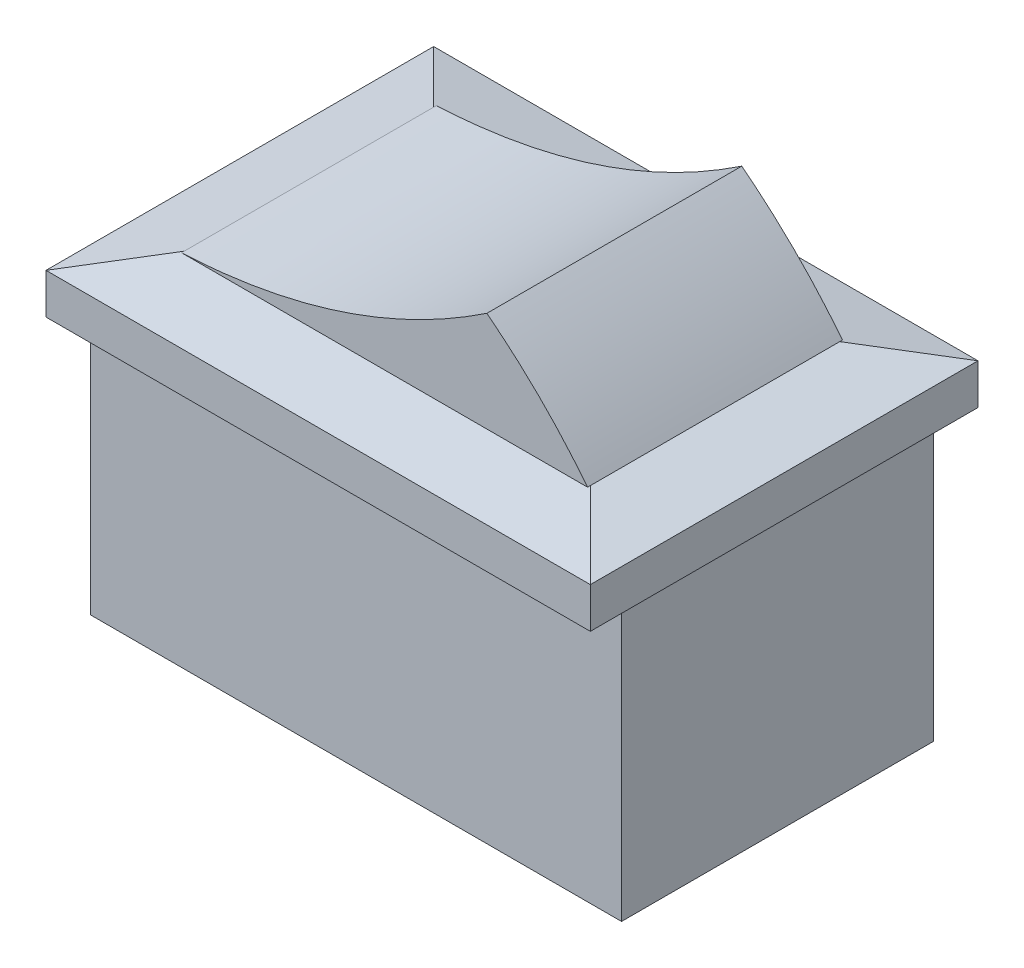
ISO-10303-21;
HEADER;
FILE_DESCRIPTION(('STEP AP214'),'2;1');
FILE_NAME('part.step','',(''),(''),'','','');
FILE_SCHEMA(('AUTOMOTIVE_DESIGN { 1 0 10303 214 1 1 1 1 }'));
ENDSEC;
DATA;
#1=APPLICATION_CONTEXT('core data for automotive mechanical design processes');
#2=APPLICATION_PROTOCOL_DEFINITION('international standard','automotive_design',2000,#1);
#3=PRODUCT_CONTEXT('',#1,'mechanical');
#4=PRODUCT('Part','Part','',(#3));
#5=PRODUCT_RELATED_PRODUCT_CATEGORY('part','',(#4));
#6=PRODUCT_DEFINITION_FORMATION('','',#4);
#7=PRODUCT_DEFINITION_CONTEXT('part definition',#1,'design');
#8=PRODUCT_DEFINITION('design','',#6,#7);
#9=PRODUCT_DEFINITION_SHAPE('','',#8);
#10=(LENGTH_UNIT() NAMED_UNIT(*) SI_UNIT(.MILLI.,.METRE.));
#11=(NAMED_UNIT(*) PLANE_ANGLE_UNIT() SI_UNIT($,.RADIAN.));
#12=(NAMED_UNIT(*) SI_UNIT($,.STERADIAN.) SOLID_ANGLE_UNIT());
#13=UNCERTAINTY_MEASURE_WITH_UNIT(LENGTH_MEASURE(1.E-05),#10,'distance_accuracy_value','');
#14=(GEOMETRIC_REPRESENTATION_CONTEXT(3) GLOBAL_UNCERTAINTY_ASSIGNED_CONTEXT((#13)) GLOBAL_UNIT_ASSIGNED_CONTEXT((#10,
#11,#12)) REPRESENTATION_CONTEXT('',''));
#15=CARTESIAN_POINT('',(0.,0.,0.));
#16=DIRECTION('',(0.,0.,1.));
#17=DIRECTION('',(1.,0.,0.));
#18=AXIS2_PLACEMENT_3D('',#15,#16,#17);
#19=CARTESIAN_POINT('',(10.16,-10.4648,-5.969));
#20=DIRECTION('',(1.,0.,0.));
#21=DIRECTION('',(0.,0.,-1.));
#22=AXIS2_PLACEMENT_3D('',#19,#20,#21);
#23=PLANE('',#22);
#24=DIRECTION('',(0.,0.,-1.));
#25=VECTOR('',#24,1.);
#26=CARTESIAN_POINT('',(10.16,0.,-5.969));
#27=LINE('',#26,#25);
#28=CARTESIAN_POINT('',(10.16,0.,5.969));
#29=VERTEX_POINT('',#28);
#30=CARTESIAN_POINT('',(10.16,0.,-5.969));
#31=VERTEX_POINT('',#30);
#32=EDGE_CURVE('E213',#29,#31,#27,.T.);
#33=ORIENTED_EDGE('',*,*,#32,.F.);
#34=DIRECTION('',(0.,1.,0.));
#35=VECTOR('',#34,1.);
#36=CARTESIAN_POINT('',(10.16,-10.4648,5.969));
#37=LINE('',#36,#35);
#38=CARTESIAN_POINT('',(10.16,-10.4648,5.969));
#39=VERTEX_POINT('',#38);
#40=EDGE_CURVE('E246',#39,#29,#37,.T.);
#41=ORIENTED_EDGE('',*,*,#40,.F.);
#42=DIRECTION('',(0.,0.,-1.));
#43=VECTOR('',#42,1.);
#44=CARTESIAN_POINT('',(10.16,-10.4648,-5.969));
#45=LINE('',#44,#43);
#46=CARTESIAN_POINT('',(10.16,-10.4648,-5.969));
#47=VERTEX_POINT('',#46);
#48=EDGE_CURVE('E214',#39,#47,#45,.T.);
#49=ORIENTED_EDGE('',*,*,#48,.T.);
#50=DIRECTION('',(0.,1.,0.));
#51=VECTOR('',#50,1.);
#52=CARTESIAN_POINT('',(10.16,-10.4648,-5.969));
#53=LINE('',#52,#51);
#54=EDGE_CURVE('E231',#47,#31,#53,.T.);
#55=ORIENTED_EDGE('',*,*,#54,.T.);
#56=EDGE_LOOP('',(#33,#41,#49,#55));
#57=FACE_BOUND('',#56,.T.);
#58=ADVANCED_FACE('F49',(#57),#23,.T.);
#59=CARTESIAN_POINT('',(-10.16,-10.4648,5.969));
#60=DIRECTION('',(0.,0.,1.));
#61=DIRECTION('',(1.,0.,0.));
#62=AXIS2_PLACEMENT_3D('',#59,#60,#61);
#63=PLANE('',#62);
#64=DIRECTION('',(1.,0.,0.));
#65=VECTOR('',#64,1.);
#66=CARTESIAN_POINT('',(-10.16,0.,5.969));
#67=LINE('',#66,#65);
#68=CARTESIAN_POINT('',(-10.16,0.,5.969));
#69=VERTEX_POINT('',#68);
#70=EDGE_CURVE('E219',#69,#29,#67,.T.);
#71=ORIENTED_EDGE('',*,*,#70,.F.);
#72=DIRECTION('',(0.,1.,0.));
#73=VECTOR('',#72,1.);
#74=CARTESIAN_POINT('',(-10.16,-10.4648,5.969));
#75=LINE('',#74,#73);
#76=CARTESIAN_POINT('',(-10.16,-10.4648,5.969));
#77=VERTEX_POINT('',#76);
#78=EDGE_CURVE('E251',#77,#69,#75,.T.);
#79=ORIENTED_EDGE('',*,*,#78,.F.);
#80=DIRECTION('',(1.,0.,0.));
#81=VECTOR('',#80,1.);
#82=CARTESIAN_POINT('',(-10.16,-10.4648,5.969));
#83=LINE('',#82,#81);
#84=EDGE_CURVE('E227',#77,#39,#83,.T.);
#85=ORIENTED_EDGE('',*,*,#84,.T.);
#86=ORIENTED_EDGE('',*,*,#40,.T.);
#87=EDGE_LOOP('',(#71,#79,#85,#86));
#88=FACE_BOUND('',#87,.T.);
#89=ADVANCED_FACE('F340',(#88),#63,.T.);
#90=CARTESIAN_POINT('',(-10.16,-10.4648,-5.969));
#91=DIRECTION('',(-1.,0.,0.));
#92=DIRECTION('',(0.,0.,1.));
#93=AXIS2_PLACEMENT_3D('',#90,#91,#92);
#94=PLANE('',#93);
#95=DIRECTION('',(0.,0.,1.));
#96=VECTOR('',#95,1.);
#97=CARTESIAN_POINT('',(-10.16,0.,-5.969));
#98=LINE('',#97,#96);
#99=CARTESIAN_POINT('',(-10.16,0.,-5.969));
#100=VERTEX_POINT('',#99);
#101=EDGE_CURVE('E239',#100,#69,#98,.T.);
#102=ORIENTED_EDGE('',*,*,#101,.F.);
#103=DIRECTION('',(0.,1.,0.));
#104=VECTOR('',#103,1.);
#105=CARTESIAN_POINT('',(-10.16,-10.4648,-5.969));
#106=LINE('',#105,#104);
#107=CARTESIAN_POINT('',(-10.16,-10.4648,-5.969));
#108=VERTEX_POINT('',#107);
#109=EDGE_CURVE('E254',#108,#100,#106,.T.);
#110=ORIENTED_EDGE('',*,*,#109,.F.);
#111=DIRECTION('',(0.,0.,1.));
#112=VECTOR('',#111,1.);
#113=CARTESIAN_POINT('',(-10.16,-10.4648,-5.969));
#114=LINE('',#113,#112);
#115=EDGE_CURVE('E223',#108,#77,#114,.T.);
#116=ORIENTED_EDGE('',*,*,#115,.T.);
#117=ORIENTED_EDGE('',*,*,#78,.T.);
#118=EDGE_LOOP('',(#102,#110,#116,#117));
#119=FACE_BOUND('',#118,.T.);
#120=ADVANCED_FACE('F347',(#119),#94,.T.);
#121=CARTESIAN_POINT('',(-10.16,-10.4648,-5.969));
#122=DIRECTION('',(0.,0.,-1.));
#123=DIRECTION('',(-1.,0.,0.));
#124=AXIS2_PLACEMENT_3D('',#121,#122,#123);
#125=PLANE('',#124);
#126=DIRECTION('',(-1.,0.,0.));
#127=VECTOR('',#126,1.);
#128=CARTESIAN_POINT('',(-10.16,0.,-5.969));
#129=LINE('',#128,#127);
#130=EDGE_CURVE('E235',#31,#100,#129,.T.);
#131=ORIENTED_EDGE('',*,*,#130,.F.);
#132=ORIENTED_EDGE('',*,*,#54,.F.);
#133=DIRECTION('',(-1.,0.,0.));
#134=VECTOR('',#133,1.);
#135=CARTESIAN_POINT('',(-10.16,-10.4648,-5.969));
#136=LINE('',#135,#134);
#137=EDGE_CURVE('E218',#47,#108,#136,.T.);
#138=ORIENTED_EDGE('',*,*,#137,.T.);
#139=ORIENTED_EDGE('',*,*,#109,.T.);
#140=EDGE_LOOP('',(#131,#132,#138,#139));
#141=FACE_BOUND('',#140,.T.);
#142=ADVANCED_FACE('F352',(#141),#125,.T.);
#143=CARTESIAN_POINT('',(0.,-10.4648,0.));
#144=DIRECTION('',(0.,1.,0.));
#145=DIRECTION('',(0.,0.,1.));
#146=AXIS2_PLACEMENT_3D('',#143,#144,#145);
#147=PLANE('',#146);
#148=ORIENTED_EDGE('',*,*,#48,.F.);
#149=ORIENTED_EDGE('',*,*,#84,.F.);
#150=ORIENTED_EDGE('',*,*,#115,.F.);
#151=ORIENTED_EDGE('',*,*,#137,.F.);
#152=EDGE_LOOP('',(#148,#149,#150,#151));
#153=FACE_BOUND('',#152,.T.);
#154=ADVANCED_FACE('F396',(#153),#147,.F.);
#155=CARTESIAN_POINT('',(0.,0.,0.));
#156=DIRECTION('',(0.,1.,0.));
#157=DIRECTION('',(0.,0.,1.));
#158=AXIS2_PLACEMENT_3D('',#155,#156,#157);
#159=PLANE('',#158);
#160=DIRECTION('',(0.,0.,-1.));
#161=VECTOR('',#160,1.);
#162=CARTESIAN_POINT('',(10.414,0.,-7.4168));
#163=LINE('',#162,#161);
#164=CARTESIAN_POINT('',(10.414,0.,7.4168));
#165=VERTEX_POINT('',#164);
#166=CARTESIAN_POINT('',(10.414,0.,-7.4168));
#167=VERTEX_POINT('',#166);
#168=EDGE_CURVE('E185',#165,#167,#163,.T.);
#169=ORIENTED_EDGE('',*,*,#168,.F.);
#170=DIRECTION('',(1.,0.,0.));
#171=VECTOR('',#170,1.);
#172=CARTESIAN_POINT('',(-10.414,0.,7.4168));
#173=LINE('',#172,#171);
#174=CARTESIAN_POINT('',(-10.414,0.,7.4168));
#175=VERTEX_POINT('',#174);
#176=EDGE_CURVE('E197',#175,#165,#173,.T.);
#177=ORIENTED_EDGE('',*,*,#176,.F.);
#178=DIRECTION('',(0.,0.,1.));
#179=VECTOR('',#178,1.);
#180=CARTESIAN_POINT('',(-10.414,0.,-7.4168));
#181=LINE('',#180,#179);
#182=CARTESIAN_POINT('',(-10.414,0.,-7.4168));
#183=VERTEX_POINT('',#182);
#184=EDGE_CURVE('E193',#183,#175,#181,.T.);
#185=ORIENTED_EDGE('',*,*,#184,.F.);
#186=DIRECTION('',(-1.,0.,0.));
#187=VECTOR('',#186,1.);
#188=CARTESIAN_POINT('',(-10.414,0.,-7.4168));
#189=LINE('',#188,#187);
#190=EDGE_CURVE('E189',#167,#183,#189,.T.);
#191=ORIENTED_EDGE('',*,*,#190,.F.);
#192=EDGE_LOOP('',(#169,#177,#185,#191));
#193=FACE_BOUND('',#192,.T.);
#194=ORIENTED_EDGE('',*,*,#70,.T.);
#195=ORIENTED_EDGE('',*,*,#32,.T.);
#196=ORIENTED_EDGE('',*,*,#130,.T.);
#197=ORIENTED_EDGE('',*,*,#101,.T.);
#198=EDGE_LOOP('',(#194,#195,#196,#197));
#199=FACE_BOUND('',#198,.T.);
#200=ADVANCED_FACE('F387',(#193,#199),#159,.F.);
#201=CARTESIAN_POINT('',(10.414,2.1844,-7.4168));
#202=DIRECTION('',(-1.,0.,0.));
#203=DIRECTION('',(0.,0.,1.));
#204=AXIS2_PLACEMENT_3D('',#201,#202,#203);
#205=PLANE('',#204);
#206=DIRECTION('',(0.,-1.,0.));
#207=VECTOR('',#206,1.);
#208=CARTESIAN_POINT('',(10.414,2.1844,-7.4168));
#209=LINE('',#208,#207);
#210=CARTESIAN_POINT('',(10.414,1.5494,-7.4168));
#211=VERTEX_POINT('',#210);
#212=EDGE_CURVE('E210',#211,#167,#209,.T.);
#213=ORIENTED_EDGE('',*,*,#212,.F.);
#214=DIRECTION('',(0.,0.,1.));
#215=VECTOR('',#214,1.);
#216=CARTESIAN_POINT('',(10.414,1.5494,7.4168));
#217=LINE('',#216,#215);
#218=CARTESIAN_POINT('',(10.414,1.5494,7.4168));
#219=VERTEX_POINT('',#218);
#220=EDGE_CURVE('E11',#211,#219,#217,.T.);
#221=ORIENTED_EDGE('',*,*,#220,.T.);
#222=DIRECTION('',(0.,-1.,0.));
#223=VECTOR('',#222,1.);
#224=CARTESIAN_POINT('',(10.414,2.1844,7.4168));
#225=LINE('',#224,#223);
#226=EDGE_CURVE('E201',#219,#165,#225,.T.);
#227=ORIENTED_EDGE('',*,*,#226,.T.);
#228=ORIENTED_EDGE('',*,*,#168,.T.);
#229=EDGE_LOOP('',(#213,#221,#227,#228));
#230=FACE_BOUND('',#229,.T.);
#231=ADVANCED_FACE('F392',(#230),#205,.F.);
#232=CARTESIAN_POINT('',(-10.414,2.1844,-7.4168));
#233=DIRECTION('',(0.,0.,1.));
#234=DIRECTION('',(1.,0.,0.));
#235=AXIS2_PLACEMENT_3D('',#232,#233,#234);
#236=PLANE('',#235);
#237=DIRECTION('',(0.,-1.,0.));
#238=VECTOR('',#237,1.);
#239=CARTESIAN_POINT('',(-10.414,2.1844,-7.4168));
#240=LINE('',#239,#238);
#241=CARTESIAN_POINT('',(-10.414,1.5494,-7.4168));
#242=VERTEX_POINT('',#241);
#243=EDGE_CURVE('E207',#242,#183,#240,.T.);
#244=ORIENTED_EDGE('',*,*,#243,.F.);
#245=DIRECTION('',(1.,0.,0.));
#246=VECTOR('',#245,1.);
#247=CARTESIAN_POINT('',(10.414,1.5494,-7.4168));
#248=LINE('',#247,#246);
#249=EDGE_CURVE('E60',#242,#211,#248,.T.);
#250=ORIENTED_EDGE('',*,*,#249,.T.);
#251=ORIENTED_EDGE('',*,*,#212,.T.);
#252=ORIENTED_EDGE('',*,*,#190,.T.);
#253=EDGE_LOOP('',(#244,#250,#251,#252));
#254=FACE_BOUND('',#253,.T.);
#255=ADVANCED_FACE('F383',(#254),#236,.F.);
#256=CARTESIAN_POINT('',(-10.414,2.1844,-7.4168));
#257=DIRECTION('',(1.,0.,0.));
#258=DIRECTION('',(0.,0.,-1.));
#259=AXIS2_PLACEMENT_3D('',#256,#257,#258);
#260=PLANE('',#259);
#261=DIRECTION('',(0.,-1.,0.));
#262=VECTOR('',#261,1.);
#263=CARTESIAN_POINT('',(-10.414,2.1844,7.4168));
#264=LINE('',#263,#262);
#265=CARTESIAN_POINT('',(-10.414,1.5494,7.4168));
#266=VERTEX_POINT('',#265);
#267=EDGE_CURVE('E204',#266,#175,#264,.T.);
#268=ORIENTED_EDGE('',*,*,#267,.F.);
#269=DIRECTION('',(0.,0.,-1.));
#270=VECTOR('',#269,1.);
#271=CARTESIAN_POINT('',(-10.414,1.5494,-7.4168));
#272=LINE('',#271,#270);
#273=EDGE_CURVE('E75',#266,#242,#272,.T.);
#274=ORIENTED_EDGE('',*,*,#273,.T.);
#275=ORIENTED_EDGE('',*,*,#243,.T.);
#276=ORIENTED_EDGE('',*,*,#184,.T.);
#277=EDGE_LOOP('',(#268,#274,#275,#276));
#278=FACE_BOUND('',#277,.T.);
#279=ADVANCED_FACE('F377',(#278),#260,.F.);
#280=CARTESIAN_POINT('',(-10.414,2.1844,7.4168));
#281=DIRECTION('',(0.,0.,-1.));
#282=DIRECTION('',(-1.,0.,0.));
#283=AXIS2_PLACEMENT_3D('',#280,#281,#282);
#284=PLANE('',#283);
#285=ORIENTED_EDGE('',*,*,#226,.F.);
#286=DIRECTION('',(-1.,0.,0.));
#287=VECTOR('',#286,1.);
#288=CARTESIAN_POINT('',(-10.414,1.5494,7.4168));
#289=LINE('',#288,#287);
#290=EDGE_CURVE('E271',#219,#266,#289,.T.);
#291=ORIENTED_EDGE('',*,*,#290,.T.);
#292=ORIENTED_EDGE('',*,*,#267,.T.);
#293=ORIENTED_EDGE('',*,*,#176,.T.);
#294=EDGE_LOOP('',(#285,#291,#292,#293));
#295=FACE_BOUND('',#294,.T.);
#296=ADVANCED_FACE('F373',(#295),#284,.F.);
#297=CARTESIAN_POINT('',(0.,2.1844,-4.77183464599258));
#298=DIRECTION('',(0.,0.972369920397677,-0.233445363855905));
#299=DIRECTION('',(1.,0.,0.));
#300=AXIS2_PLACEMENT_3D('',#297,#298,#299);
#301=PLANE('',#300);
#302=DIRECTION('',(-0.697132827921861,0.167366784241492,0.697132827921861));
#303=VECTOR('',#302,1.);
#304=CARTESIAN_POINT('',(5.44995078123287,2.74116277645423,-2.45275078123286));
#305=LINE('',#304,#303);
#306=CARTESIAN_POINT('',(7.76903464599259,2.1844,-4.77183464599258));
#307=VERTEX_POINT('',#306);
#308=EDGE_CURVE('E280',#211,#307,#305,.T.);
#309=ORIENTED_EDGE('',*,*,#308,.F.);
#310=ORIENTED_EDGE('',*,*,#249,.F.);
#311=DIRECTION('',(0.697132827921861,0.167366784241492,0.697132827921861));
#312=VECTOR('',#311,1.);
#313=CARTESIAN_POINT('',(-3.99332902563721,3.09086671998674,-0.996129025637213));
#314=LINE('',#313,#312);
#315=CARTESIAN_POINT('',(-7.76903464599258,2.1844,-4.77183464599259));
#316=VERTEX_POINT('',#315);
#317=EDGE_CURVE('E54',#316,#242,#314,.F.);
#318=ORIENTED_EDGE('',*,*,#317,.F.);
#319=DIRECTION('',(-1.,0.,0.));
#320=VECTOR('',#319,1.);
#321=CARTESIAN_POINT('',(-10.414,2.1844,-4.77183464599258));
#322=LINE('',#321,#320);
#323=EDGE_CURVE('E262',#307,#316,#322,.T.);
#324=ORIENTED_EDGE('',*,*,#323,.F.);
#325=EDGE_LOOP('',(#309,#310,#318,#324));
#326=FACE_BOUND('',#325,.T.);
#327=ADVANCED_FACE('F52',(#326),#301,.T.);
#328=CARTESIAN_POINT('',(-7.76903464599258,2.1844,0.));
#329=DIRECTION('',(-0.233445363855905,0.972369920397677,0.));
#330=DIRECTION('',(0.,0.,-1.));
#331=AXIS2_PLACEMENT_3D('',#328,#329,#330);
#332=PLANE('',#331);
#333=ORIENTED_EDGE('',*,*,#317,.T.);
#334=ORIENTED_EDGE('',*,*,#273,.F.);
#335=DIRECTION('',(0.697132827921861,0.167366784241492,-0.697132827921861));
#336=VECTOR('',#335,1.);
#337=CARTESIAN_POINT('',(-5.44995078123285,2.74116277645423,2.45275078123286));
#338=LINE('',#337,#336);
#339=CARTESIAN_POINT('',(-7.76903464599258,2.1844,4.77183464599259));
#340=VERTEX_POINT('',#339);
#341=EDGE_CURVE('E180',#340,#266,#338,.F.);
#342=ORIENTED_EDGE('',*,*,#341,.F.);
#343=DIRECTION('',(0.,0.,1.));
#344=VECTOR('',#343,1.);
#345=CARTESIAN_POINT('',(-7.76903464599258,2.1844,7.4168));
#346=LINE('',#345,#344);
#347=EDGE_CURVE('E173',#316,#340,#346,.T.);
#348=ORIENTED_EDGE('',*,*,#347,.F.);
#349=EDGE_LOOP('',(#333,#334,#342,#348));
#350=FACE_BOUND('',#349,.T.);
#351=ADVANCED_FACE('F292',(#350),#332,.T.);
#352=CARTESIAN_POINT('',(7.76903464599259,2.1844,0.));
#353=DIRECTION('',(0.233445363855905,0.972369920397677,0.));
#354=DIRECTION('',(0.,0.,1.));
#355=AXIS2_PLACEMENT_3D('',#352,#353,#354);
#356=PLANE('',#355);
#357=ORIENTED_EDGE('',*,*,#308,.T.);
#358=DIRECTION('',(0.,0.,-1.));
#359=VECTOR('',#358,1.);
#360=CARTESIAN_POINT('',(7.76903464599259,2.1844,-7.4168));
#361=LINE('',#360,#359);
#362=CARTESIAN_POINT('',(7.76903464599259,2.1844,4.77183464599259));
#363=VERTEX_POINT('',#362);
#364=EDGE_CURVE('E250',#363,#307,#361,.T.);
#365=ORIENTED_EDGE('',*,*,#364,.F.);
#366=DIRECTION('',(0.697132827921861,-0.167366784241492,0.697132827921861));
#367=VECTOR('',#366,1.);
#368=CARTESIAN_POINT('',(5.44995078123287,2.74116277645424,2.45275078123286));
#369=LINE('',#368,#367);
#370=EDGE_CURVE('E175',#219,#363,#369,.F.);
#371=ORIENTED_EDGE('',*,*,#370,.F.);
#372=ORIENTED_EDGE('',*,*,#220,.F.);
#373=EDGE_LOOP('',(#357,#365,#371,#372));
#374=FACE_BOUND('',#373,.T.);
#375=ADVANCED_FACE('F361',(#374),#356,.T.);
#376=CARTESIAN_POINT('',(0.,2.1844,4.77183464599259));
#377=DIRECTION('',(0.,0.972369920397677,0.233445363855905));
#378=DIRECTION('',(-1.,0.,0.));
#379=AXIS2_PLACEMENT_3D('',#376,#377,#378);
#380=PLANE('',#379);
#381=ORIENTED_EDGE('',*,*,#341,.T.);
#382=ORIENTED_EDGE('',*,*,#290,.F.);
#383=ORIENTED_EDGE('',*,*,#370,.T.);
#384=DIRECTION('',(1.,0.,0.));
#385=VECTOR('',#384,1.);
#386=CARTESIAN_POINT('',(10.414,2.1844,4.77183464599259));
#387=LINE('',#386,#385);
#388=EDGE_CURVE('E268',#340,#363,#387,.T.);
#389=ORIENTED_EDGE('',*,*,#388,.F.);
#390=EDGE_LOOP('',(#381,#382,#383,#389));
#391=FACE_BOUND('',#390,.T.);
#392=ADVANCED_FACE('F355',(#391),#380,.T.);
#393=CARTESIAN_POINT('',(-7.76903464599258,2.1844,4.8768));
#394=DIRECTION('',(0.,1.,0.));
#395=DIRECTION('',(0.,0.,1.));
#396=AXIS2_PLACEMENT_3D('',#393,#394,#395);
#397=PLANE('',#396);
#398=DIRECTION('',(0.,0.,-1.));
#399=VECTOR('',#398,1.);
#400=CARTESIAN_POINT('',(-7.76903464599258,2.1844,4.8768));
#401=LINE('',#400,#399);
#402=CARTESIAN_POINT('',(-7.76903464599258,2.1844,4.8768));
#403=VERTEX_POINT('',#402);
#404=EDGE_CURVE('E152',#403,#340,#401,.T.);
#405=ORIENTED_EDGE('',*,*,#404,.T.);
#406=ORIENTED_EDGE('',*,*,#388,.T.);
#407=DIRECTION('',(0.,0.,-1.));
#408=VECTOR('',#407,1.);
#409=CARTESIAN_POINT('',(7.76903464599259,2.1844,4.8768));
#410=LINE('',#409,#408);
#411=CARTESIAN_POINT('',(7.76903464599259,2.1844,4.8768));
#412=VERTEX_POINT('',#411);
#413=EDGE_CURVE('E154',#412,#363,#410,.T.);
#414=ORIENTED_EDGE('',*,*,#413,.F.);
#415=DIRECTION('',(1.,0.,0.));
#416=VECTOR('',#415,1.);
#417=CARTESIAN_POINT('',(-7.76903464599258,2.1844,4.8768));
#418=LINE('',#417,#416);
#419=EDGE_CURVE('E147',#403,#412,#418,.T.);
#420=ORIENTED_EDGE('',*,*,#419,.F.);
#421=EDGE_LOOP('',(#405,#406,#414,#420));
#422=FACE_BOUND('',#421,.T.);
#423=ADVANCED_FACE('F149',(#422),#397,.F.);
#424=CARTESIAN_POINT('',(7.76903464599259,2.1844,-4.8768));
#425=VERTEX_POINT('',#424);
#426=EDGE_CURVE('E298',#307,#425,#410,.T.);
#427=ORIENTED_EDGE('',*,*,#426,.F.);
#428=ORIENTED_EDGE('',*,*,#323,.T.);
#429=CARTESIAN_POINT('',(-7.76903464599258,2.1844,-4.8768));
#430=VERTEX_POINT('',#429);
#431=EDGE_CURVE('E176',#316,#430,#401,.T.);
#432=ORIENTED_EDGE('',*,*,#431,.T.);
#433=DIRECTION('',(1.,0.,0.));
#434=VECTOR('',#433,1.);
#435=CARTESIAN_POINT('',(-7.76903464599258,2.1844,-4.8768));
#436=LINE('',#435,#434);
#437=EDGE_CURVE('E305',#430,#425,#436,.T.);
#438=ORIENTED_EDGE('',*,*,#437,.T.);
#439=EDGE_LOOP('',(#427,#428,#432,#438));
#440=FACE_BOUND('',#439,.T.);
#441=ADVANCED_FACE('F295',(#440),#397,.F.);
#442=CARTESIAN_POINT('',(3.91496535400742,6.0198,4.8768));
#443=CARTESIAN_POINT('',(-1.38202613240981,2.47751444171412,4.8768));
#444=CARTESIAN_POINT('',(-7.76903464599258,2.1844,4.8768));
#445=B_SPLINE_CURVE_WITH_KNOTS('',2,(#442,#443,#444),.UNSPECIFIED.,.F.,.F.,(3,3),(0.,1.),.UNSPECIFIED.);
#446=DIRECTION('',(0.,0.,-1.));
#447=VECTOR('',#446,1.);
#448=SURFACE_OF_LINEAR_EXTRUSION('',#445,#447);
#449=CARTESIAN_POINT('',(3.91496535400742,6.0198,-4.8768));
#450=CARTESIAN_POINT('',(-1.38202613240981,2.47751444171412,-4.8768));
#451=CARTESIAN_POINT('',(-7.76903464599258,2.1844,-4.8768));
#452=B_SPLINE_CURVE_WITH_KNOTS('',2,(#449,#450,#451),.UNSPECIFIED.,.F.,.F.,(3,3),(0.,1.),.UNSPECIFIED.);
#453=CARTESIAN_POINT('',(3.91496535400742,6.0198,-4.8768));
#454=VERTEX_POINT('',#453);
#455=EDGE_CURVE('E300',#454,#430,#452,.T.);
#456=ORIENTED_EDGE('',*,*,#455,.T.);
#457=ORIENTED_EDGE('',*,*,#431,.F.);
#458=ORIENTED_EDGE('',*,*,#347,.T.);
#459=ORIENTED_EDGE('',*,*,#404,.F.);
#460=CARTESIAN_POINT('',(3.91496535400742,6.0198,4.8768));
#461=VERTEX_POINT('',#460);
#462=EDGE_CURVE('E159',#461,#403,#445,.T.);
#463=ORIENTED_EDGE('',*,*,#462,.F.);
#464=DIRECTION('',(0.,0.,-1.));
#465=VECTOR('',#464,1.);
#466=CARTESIAN_POINT('',(3.91496535400742,6.0198,4.8768));
#467=LINE('',#466,#465);
#468=EDGE_CURVE('E301',#461,#454,#467,.T.);
#469=ORIENTED_EDGE('',*,*,#468,.T.);
#470=EDGE_LOOP('',(#456,#457,#458,#459,#463,#469));
#471=FACE_BOUND('',#470,.T.);
#472=ADVANCED_FACE('F171',(#471),#448,.F.);
#473=CARTESIAN_POINT('',(7.76903464599259,2.1844,4.8768));
#474=CARTESIAN_POINT('',(6.07653379378971,4.33646190446012,4.8768));
#475=CARTESIAN_POINT('',(3.91496535400742,6.0198,4.8768));
#476=B_SPLINE_CURVE_WITH_KNOTS('',2,(#473,#474,#475),.UNSPECIFIED.,.F.,.F.,(3,3),(0.,1.),.UNSPECIFIED.);
#477=DIRECTION('',(0.,0.,-1.));
#478=VECTOR('',#477,1.);
#479=SURFACE_OF_LINEAR_EXTRUSION('',#476,#478);
#480=CARTESIAN_POINT('',(7.76903464599259,2.1844,-4.8768));
#481=CARTESIAN_POINT('',(6.07653379378971,4.33646190446012,-4.8768));
#482=CARTESIAN_POINT('',(3.91496535400742,6.0198,-4.8768));
#483=B_SPLINE_CURVE_WITH_KNOTS('',2,(#480,#481,#482),.UNSPECIFIED.,.F.,.F.,(3,3),(0.,1.),.UNSPECIFIED.);
#484=EDGE_CURVE('E167',#425,#454,#483,.T.);
#485=ORIENTED_EDGE('',*,*,#484,.T.);
#486=ORIENTED_EDGE('',*,*,#468,.F.);
#487=EDGE_CURVE('E158',#412,#461,#476,.T.);
#488=ORIENTED_EDGE('',*,*,#487,.F.);
#489=ORIENTED_EDGE('',*,*,#413,.T.);
#490=ORIENTED_EDGE('',*,*,#364,.T.);
#491=ORIENTED_EDGE('',*,*,#426,.T.);
#492=EDGE_LOOP('',(#485,#486,#488,#489,#490,#491));
#493=FACE_BOUND('',#492,.T.);
#494=ADVANCED_FACE('F330',(#493),#479,.F.);
#495=CARTESIAN_POINT('',(-1.65453038920119,3.28980722085706,4.8768));
#496=DIRECTION('',(0.,0.,-1.));
#497=DIRECTION('',(-1.,0.,0.));
#498=AXIS2_PLACEMENT_3D('',#495,#496,#497);
#499=PLANE('',#498);
#500=ORIENTED_EDGE('',*,*,#462,.T.);
#501=ORIENTED_EDGE('',*,*,#419,.T.);
#502=ORIENTED_EDGE('',*,*,#487,.T.);
#503=EDGE_LOOP('',(#500,#501,#502));
#504=FACE_BOUND('',#503,.T.);
#505=ADVANCED_FACE('F162',(#504),#499,.F.);
#506=CARTESIAN_POINT('',(-1.65453038920119,3.28980722085706,-4.8768));
#507=DIRECTION('',(0.,0.,-1.));
#508=DIRECTION('',(-1.,0.,0.));
#509=AXIS2_PLACEMENT_3D('',#506,#507,#508);
#510=PLANE('',#509);
#511=ORIENTED_EDGE('',*,*,#455,.F.);
#512=ORIENTED_EDGE('',*,*,#484,.F.);
#513=ORIENTED_EDGE('',*,*,#437,.F.);
#514=EDGE_LOOP('',(#511,#512,#513));
#515=FACE_BOUND('',#514,.T.);
#516=ADVANCED_FACE('F331',(#515),#510,.T.);
#517=CLOSED_SHELL('',(#58,#89,#120,#142,#154,#200,#231,#255,#279,#296,#327,#351,#375,#392,#423,
#441,#472,#494,#505,#516));
#518=MANIFOLD_SOLID_BREP('B2',#517);
#519=ADVANCED_BREP_SHAPE_REPRESENTATION('',(#18,#518),#14);
#520=SHAPE_DEFINITION_REPRESENTATION(#9,#519);
ENDSEC;
END-ISO-10303-21;
